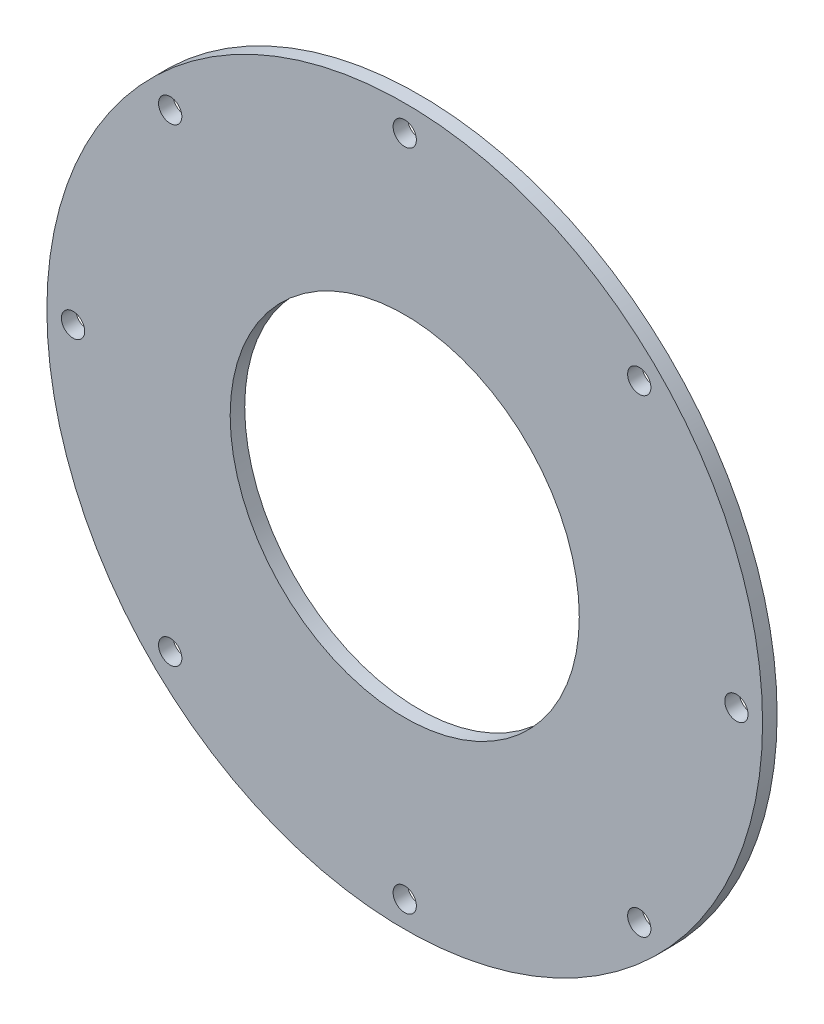
ISO-10303-21;
HEADER;
FILE_DESCRIPTION(('STEP AP214'),'2;1');
FILE_NAME('part.step','',(''),(''),'','','');
FILE_SCHEMA(('AUTOMOTIVE_DESIGN { 1 0 10303 214 1 1 1 1 }'));
ENDSEC;
DATA;
#1=APPLICATION_CONTEXT('core data for automotive mechanical design processes');
#2=APPLICATION_PROTOCOL_DEFINITION('international standard','automotive_design',2000,#1);
#3=PRODUCT_CONTEXT('',#1,'mechanical');
#4=PRODUCT('Part','Part','',(#3));
#5=PRODUCT_RELATED_PRODUCT_CATEGORY('part','',(#4));
#6=PRODUCT_DEFINITION_FORMATION('','',#4);
#7=PRODUCT_DEFINITION_CONTEXT('part definition',#1,'design');
#8=PRODUCT_DEFINITION('design','',#6,#7);
#9=PRODUCT_DEFINITION_SHAPE('','',#8);
#10=(LENGTH_UNIT() NAMED_UNIT(*) SI_UNIT(.MILLI.,.METRE.));
#11=(NAMED_UNIT(*) PLANE_ANGLE_UNIT() SI_UNIT($,.RADIAN.));
#12=(NAMED_UNIT(*) SI_UNIT($,.STERADIAN.) SOLID_ANGLE_UNIT());
#13=UNCERTAINTY_MEASURE_WITH_UNIT(LENGTH_MEASURE(1.E-05),#10,'distance_accuracy_value','');
#14=(GEOMETRIC_REPRESENTATION_CONTEXT(3) GLOBAL_UNCERTAINTY_ASSIGNED_CONTEXT((#13)) GLOBAL_UNIT_ASSIGNED_CONTEXT((#10,
#11,#12)) REPRESENTATION_CONTEXT('',''));
#15=CARTESIAN_POINT('',(0.,0.,0.));
#16=DIRECTION('',(0.,0.,1.));
#17=DIRECTION('',(1.,0.,0.));
#18=AXIS2_PLACEMENT_3D('',#15,#16,#17);
#19=CARTESIAN_POINT('',(0.,0.,2.5));
#20=DIRECTION('',(0.,0.,1.));
#21=DIRECTION('',(1.,0.,0.));
#22=AXIS2_PLACEMENT_3D('',#19,#20,#21);
#23=PLANE('',#22);
#24=CARTESIAN_POINT('',(0.,0.,2.5));
#25=DIRECTION('',(0.,0.,1.));
#26=DIRECTION('',(1.,0.,0.));
#27=AXIS2_PLACEMENT_3D('',#24,#25,#26);
#28=CIRCLE('',#27,30.);
#29=CARTESIAN_POINT('',(30.,0.,2.5));
#30=VERTEX_POINT('',#29);
#31=EDGE_CURVE('E117',#30,#30,#28,.T.);
#32=ORIENTED_EDGE('',*,*,#31,.F.);
#33=EDGE_LOOP('',(#32));
#34=FACE_BOUND('',#33,.T.);
#35=CARTESIAN_POINT('',(57.,-5.96492217882559E-13,2.5));
#36=DIRECTION('',(0.,0.,1.));
#37=DIRECTION('',(1.,0.,0.));
#38=AXIS2_PLACEMENT_3D('',#35,#36,#37);
#39=CIRCLE('',#38,2.);
#40=CARTESIAN_POINT('',(59.,-5.96492217882559E-13,2.5));
#41=VERTEX_POINT('',#40);
#42=EDGE_CURVE('E98',#41,#41,#39,.T.);
#43=ORIENTED_EDGE('',*,*,#42,.F.);
#44=EDGE_LOOP('',(#43));
#45=FACE_BOUND('',#44,.T.);
#46=CARTESIAN_POINT('',(3.97477781568501E-13,57.,2.5));
#47=DIRECTION('',(0.,0.,1.));
#48=DIRECTION('',(1.,0.,0.));
#49=AXIS2_PLACEMENT_3D('',#46,#47,#48);
#50=CIRCLE('',#49,2.);
#51=CARTESIAN_POINT('',(2.0000000000004,57.,2.5));
#52=VERTEX_POINT('',#51);
#53=EDGE_CURVE('E82',#52,#52,#50,.T.);
#54=ORIENTED_EDGE('',*,*,#53,.F.);
#55=EDGE_LOOP('',(#54));
#56=FACE_BOUND('',#55,.T.);
#57=CARTESIAN_POINT('',(-57.,1.00835959934104E-12,2.5));
#58=DIRECTION('',(0.,0.,1.));
#59=DIRECTION('',(1.,0.,0.));
#60=AXIS2_PLACEMENT_3D('',#57,#58,#59);
#61=CIRCLE('',#60,2.);
#62=CARTESIAN_POINT('',(-55.,1.00835959934104E-12,2.5));
#63=VERTEX_POINT('',#62);
#64=EDGE_CURVE('E66',#63,#63,#61,.T.);
#65=ORIENTED_EDGE('',*,*,#64,.F.);
#66=EDGE_LOOP('',(#65));
#67=FACE_BOUND('',#66,.T.);
#68=CARTESIAN_POINT('',(0.,-57.,2.5));
#69=DIRECTION('',(0.,0.,1.));
#70=DIRECTION('',(1.,0.,0.));
#71=AXIS2_PLACEMENT_3D('',#68,#69,#70);
#72=CIRCLE('',#71,2.);
#73=CARTESIAN_POINT('',(2.,-57.,2.5));
#74=VERTEX_POINT('',#73);
#75=EDGE_CURVE('E52',#74,#74,#72,.T.);
#76=ORIENTED_EDGE('',*,*,#75,.F.);
#77=EDGE_LOOP('',(#76));
#78=FACE_BOUND('',#77,.T.);
#79=CARTESIAN_POINT('',(0.,0.,2.5));
#80=DIRECTION('',(0.,0.,1.));
#81=DIRECTION('',(1.,0.,0.));
#82=AXIS2_PLACEMENT_3D('',#79,#80,#81);
#83=CIRCLE('',#82,61.5);
#84=CARTESIAN_POINT('',(61.5,0.,2.5));
#85=VERTEX_POINT('',#84);
#86=EDGE_CURVE('E10',#85,#85,#83,.T.);
#87=ORIENTED_EDGE('',*,*,#86,.T.);
#88=EDGE_LOOP('',(#87));
#89=FACE_BOUND('',#88,.T.);
#90=CARTESIAN_POINT('',(-40.3050865276338,-40.3050865276326,2.5));
#91=DIRECTION('',(0.,0.,1.));
#92=DIRECTION('',(1.,0.,0.));
#93=AXIS2_PLACEMENT_3D('',#90,#91,#92);
#94=CIRCLE('',#93,2.00000000000001);
#95=CARTESIAN_POINT('',(-38.3050865276338,-40.3050865276326,2.5));
#96=VERTEX_POINT('',#95);
#97=EDGE_CURVE('E58',#96,#96,#94,.T.);
#98=ORIENTED_EDGE('',*,*,#97,.F.);
#99=EDGE_LOOP('',(#98));
#100=FACE_BOUND('',#99,.T.);
#101=CARTESIAN_POINT('',(-40.305086527633,40.3050865276334,2.5));
#102=DIRECTION('',(0.,0.,1.));
#103=DIRECTION('',(1.,0.,0.));
#104=AXIS2_PLACEMENT_3D('',#101,#102,#103);
#105=CIRCLE('',#104,2.00000000000001);
#106=CARTESIAN_POINT('',(-38.305086527633,40.3050865276334,2.5));
#107=VERTEX_POINT('',#106);
#108=EDGE_CURVE('E74',#107,#107,#105,.T.);
#109=ORIENTED_EDGE('',*,*,#108,.F.);
#110=EDGE_LOOP('',(#109));
#111=FACE_BOUND('',#110,.T.);
#112=CARTESIAN_POINT('',(40.3050865276336,40.3050865276329,2.5));
#113=DIRECTION('',(0.,0.,1.));
#114=DIRECTION('',(1.,0.,0.));
#115=AXIS2_PLACEMENT_3D('',#112,#113,#114);
#116=CIRCLE('',#115,2.00000000000001);
#117=CARTESIAN_POINT('',(42.3050865276336,40.3050865276329,2.5));
#118=VERTEX_POINT('',#117);
#119=EDGE_CURVE('E90',#118,#118,#116,.T.);
#120=ORIENTED_EDGE('',*,*,#119,.F.);
#121=EDGE_LOOP('',(#120));
#122=FACE_BOUND('',#121,.T.);
#123=CARTESIAN_POINT('',(40.3050865276327,-40.3050865276337,2.5));
#124=DIRECTION('',(0.,0.,1.));
#125=DIRECTION('',(1.,0.,0.));
#126=AXIS2_PLACEMENT_3D('',#123,#124,#125);
#127=CIRCLE('',#126,2.00000000000001);
#128=CARTESIAN_POINT('',(42.3050865276327,-40.3050865276337,2.5));
#129=VERTEX_POINT('',#128);
#130=EDGE_CURVE('E106',#129,#129,#127,.T.);
#131=ORIENTED_EDGE('',*,*,#130,.F.);
#132=EDGE_LOOP('',(#131));
#133=FACE_BOUND('',#132,.T.);
#134=ADVANCED_FACE('F37',(#34,#45,#56,#67,#78,#89,#100,#111,#122,#133),#23,.T.);
#135=CARTESIAN_POINT('',(0.,0.,0.));
#136=DIRECTION('',(0.,0.,1.));
#137=DIRECTION('',(1.,0.,0.));
#138=AXIS2_PLACEMENT_3D('',#135,#136,#137);
#139=PLANE('',#138);
#140=CARTESIAN_POINT('',(0.,0.,0.));
#141=DIRECTION('',(0.,0.,1.));
#142=DIRECTION('',(1.,0.,0.));
#143=AXIS2_PLACEMENT_3D('',#140,#141,#142);
#144=CIRCLE('',#143,30.);
#145=CARTESIAN_POINT('',(30.,0.,0.));
#146=VERTEX_POINT('',#145);
#147=EDGE_CURVE('E41',#146,#146,#144,.T.);
#148=ORIENTED_EDGE('',*,*,#147,.T.);
#149=EDGE_LOOP('',(#148));
#150=FACE_BOUND('',#149,.T.);
#151=CARTESIAN_POINT('',(0.,0.,0.));
#152=DIRECTION('',(0.,0.,1.));
#153=DIRECTION('',(1.,0.,0.));
#154=AXIS2_PLACEMENT_3D('',#151,#152,#153);
#155=CIRCLE('',#154,61.5);
#156=CARTESIAN_POINT('',(61.5,0.,0.));
#157=VERTEX_POINT('',#156);
#158=EDGE_CURVE('E46',#157,#157,#155,.T.);
#159=ORIENTED_EDGE('',*,*,#158,.F.);
#160=EDGE_LOOP('',(#159));
#161=FACE_BOUND('',#160,.T.);
#162=CARTESIAN_POINT('',(0.,-57.,0.));
#163=DIRECTION('',(0.,0.,1.));
#164=DIRECTION('',(1.,0.,0.));
#165=AXIS2_PLACEMENT_3D('',#162,#163,#164);
#166=CIRCLE('',#165,2.);
#167=CARTESIAN_POINT('',(2.,-57.,0.));
#168=VERTEX_POINT('',#167);
#169=EDGE_CURVE('E54',#168,#168,#166,.T.);
#170=ORIENTED_EDGE('',*,*,#169,.T.);
#171=EDGE_LOOP('',(#170));
#172=FACE_BOUND('',#171,.T.);
#173=CARTESIAN_POINT('',(-40.3050865276338,-40.3050865276326,0.));
#174=DIRECTION('',(0.,0.,1.));
#175=DIRECTION('',(1.,0.,0.));
#176=AXIS2_PLACEMENT_3D('',#173,#174,#175);
#177=CIRCLE('',#176,2.00000000000001);
#178=CARTESIAN_POINT('',(-38.3050865276338,-40.3050865276326,0.));
#179=VERTEX_POINT('',#178);
#180=EDGE_CURVE('E62',#179,#179,#177,.T.);
#181=ORIENTED_EDGE('',*,*,#180,.T.);
#182=EDGE_LOOP('',(#181));
#183=FACE_BOUND('',#182,.T.);
#184=CARTESIAN_POINT('',(-57.,1.00835959934104E-12,0.));
#185=DIRECTION('',(0.,0.,1.));
#186=DIRECTION('',(1.,0.,0.));
#187=AXIS2_PLACEMENT_3D('',#184,#185,#186);
#188=CIRCLE('',#187,2.);
#189=CARTESIAN_POINT('',(-55.,1.00835959934104E-12,0.));
#190=VERTEX_POINT('',#189);
#191=EDGE_CURVE('E70',#190,#190,#188,.T.);
#192=ORIENTED_EDGE('',*,*,#191,.T.);
#193=EDGE_LOOP('',(#192));
#194=FACE_BOUND('',#193,.T.);
#195=CARTESIAN_POINT('',(-40.305086527633,40.3050865276334,0.));
#196=DIRECTION('',(0.,0.,1.));
#197=DIRECTION('',(1.,0.,0.));
#198=AXIS2_PLACEMENT_3D('',#195,#196,#197);
#199=CIRCLE('',#198,2.00000000000001);
#200=CARTESIAN_POINT('',(-38.305086527633,40.3050865276334,0.));
#201=VERTEX_POINT('',#200);
#202=EDGE_CURVE('E78',#201,#201,#199,.T.);
#203=ORIENTED_EDGE('',*,*,#202,.T.);
#204=EDGE_LOOP('',(#203));
#205=FACE_BOUND('',#204,.T.);
#206=CARTESIAN_POINT('',(3.97477781568501E-13,57.,0.));
#207=DIRECTION('',(0.,0.,1.));
#208=DIRECTION('',(1.,0.,0.));
#209=AXIS2_PLACEMENT_3D('',#206,#207,#208);
#210=CIRCLE('',#209,2.);
#211=CARTESIAN_POINT('',(2.0000000000004,57.,0.));
#212=VERTEX_POINT('',#211);
#213=EDGE_CURVE('E86',#212,#212,#210,.T.);
#214=ORIENTED_EDGE('',*,*,#213,.T.);
#215=EDGE_LOOP('',(#214));
#216=FACE_BOUND('',#215,.T.);
#217=CARTESIAN_POINT('',(40.3050865276336,40.3050865276329,0.));
#218=DIRECTION('',(0.,0.,1.));
#219=DIRECTION('',(1.,0.,0.));
#220=AXIS2_PLACEMENT_3D('',#217,#218,#219);
#221=CIRCLE('',#220,2.00000000000001);
#222=CARTESIAN_POINT('',(42.3050865276336,40.3050865276329,0.));
#223=VERTEX_POINT('',#222);
#224=EDGE_CURVE('E94',#223,#223,#221,.T.);
#225=ORIENTED_EDGE('',*,*,#224,.T.);
#226=EDGE_LOOP('',(#225));
#227=FACE_BOUND('',#226,.T.);
#228=CARTESIAN_POINT('',(57.,-5.96492217882559E-13,0.));
#229=DIRECTION('',(0.,0.,1.));
#230=DIRECTION('',(1.,0.,0.));
#231=AXIS2_PLACEMENT_3D('',#228,#229,#230);
#232=CIRCLE('',#231,2.);
#233=CARTESIAN_POINT('',(59.,-5.96492217882559E-13,0.));
#234=VERTEX_POINT('',#233);
#235=EDGE_CURVE('E102',#234,#234,#232,.T.);
#236=ORIENTED_EDGE('',*,*,#235,.T.);
#237=EDGE_LOOP('',(#236));
#238=FACE_BOUND('',#237,.T.);
#239=CARTESIAN_POINT('',(40.3050865276327,-40.3050865276337,0.));
#240=DIRECTION('',(0.,0.,1.));
#241=DIRECTION('',(1.,0.,0.));
#242=AXIS2_PLACEMENT_3D('',#239,#240,#241);
#243=CIRCLE('',#242,2.00000000000001);
#244=CARTESIAN_POINT('',(42.3050865276327,-40.3050865276337,0.));
#245=VERTEX_POINT('',#244);
#246=EDGE_CURVE('E110',#245,#245,#243,.T.);
#247=ORIENTED_EDGE('',*,*,#246,.T.);
#248=EDGE_LOOP('',(#247));
#249=FACE_BOUND('',#248,.T.);
#250=ADVANCED_FACE('F126',(#150,#161,#172,#183,#194,#205,#216,#227,#238,#249),#139,.F.);
#251=CARTESIAN_POINT('',(0.,0.,2.5));
#252=DIRECTION('',(0.,0.,-1.));
#253=DIRECTION('',(-1.,0.,0.));
#254=AXIS2_PLACEMENT_3D('',#251,#252,#253);
#255=CYLINDRICAL_SURFACE('',#254,61.5);
#256=ORIENTED_EDGE('',*,*,#86,.F.);
#257=EDGE_LOOP('',(#256));
#258=FACE_BOUND('',#257,.T.);
#259=ORIENTED_EDGE('',*,*,#158,.T.);
#260=EDGE_LOOP('',(#259));
#261=FACE_BOUND('',#260,.T.);
#262=ADVANCED_FACE('F39',(#258,#261),#255,.T.);
#263=CARTESIAN_POINT('',(0.,-57.,2.5));
#264=DIRECTION('',(0.,0.,-1.));
#265=DIRECTION('',(-1.,0.,0.));
#266=AXIS2_PLACEMENT_3D('',#263,#264,#265);
#267=CYLINDRICAL_SURFACE('',#266,2.);
#268=ORIENTED_EDGE('',*,*,#75,.T.);
#269=EDGE_LOOP('',(#268));
#270=FACE_BOUND('',#269,.T.);
#271=ORIENTED_EDGE('',*,*,#169,.F.);
#272=EDGE_LOOP('',(#271));
#273=FACE_BOUND('',#272,.T.);
#274=ADVANCED_FACE('F147',(#270,#273),#267,.F.);
#275=CARTESIAN_POINT('',(-40.3050865276338,-40.3050865276326,2.5));
#276=DIRECTION('',(0.,0.,-1.));
#277=DIRECTION('',(-1.,0.,0.));
#278=AXIS2_PLACEMENT_3D('',#275,#276,#277);
#279=CYLINDRICAL_SURFACE('',#278,2.00000000000001);
#280=ORIENTED_EDGE('',*,*,#97,.T.);
#281=EDGE_LOOP('',(#280));
#282=FACE_BOUND('',#281,.T.);
#283=ORIENTED_EDGE('',*,*,#180,.F.);
#284=EDGE_LOOP('',(#283));
#285=FACE_BOUND('',#284,.T.);
#286=ADVANCED_FACE('F150',(#282,#285),#279,.F.);
#287=CARTESIAN_POINT('',(-57.,1.00835959934104E-12,2.5));
#288=DIRECTION('',(0.,0.,-1.));
#289=DIRECTION('',(-1.,0.,0.));
#290=AXIS2_PLACEMENT_3D('',#287,#288,#289);
#291=CYLINDRICAL_SURFACE('',#290,2.);
#292=ORIENTED_EDGE('',*,*,#64,.T.);
#293=EDGE_LOOP('',(#292));
#294=FACE_BOUND('',#293,.T.);
#295=ORIENTED_EDGE('',*,*,#191,.F.);
#296=EDGE_LOOP('',(#295));
#297=FACE_BOUND('',#296,.T.);
#298=ADVANCED_FACE('F154',(#294,#297),#291,.F.);
#299=CARTESIAN_POINT('',(-40.305086527633,40.3050865276334,2.5));
#300=DIRECTION('',(0.,0.,-1.));
#301=DIRECTION('',(-1.,0.,0.));
#302=AXIS2_PLACEMENT_3D('',#299,#300,#301);
#303=CYLINDRICAL_SURFACE('',#302,2.00000000000001);
#304=ORIENTED_EDGE('',*,*,#108,.T.);
#305=EDGE_LOOP('',(#304));
#306=FACE_BOUND('',#305,.T.);
#307=ORIENTED_EDGE('',*,*,#202,.F.);
#308=EDGE_LOOP('',(#307));
#309=FACE_BOUND('',#308,.T.);
#310=ADVANCED_FACE('F158',(#306,#309),#303,.F.);
#311=CARTESIAN_POINT('',(3.97477781568501E-13,57.,2.5));
#312=DIRECTION('',(0.,0.,-1.));
#313=DIRECTION('',(-1.,0.,0.));
#314=AXIS2_PLACEMENT_3D('',#311,#312,#313);
#315=CYLINDRICAL_SURFACE('',#314,2.);
#316=ORIENTED_EDGE('',*,*,#53,.T.);
#317=EDGE_LOOP('',(#316));
#318=FACE_BOUND('',#317,.T.);
#319=ORIENTED_EDGE('',*,*,#213,.F.);
#320=EDGE_LOOP('',(#319));
#321=FACE_BOUND('',#320,.T.);
#322=ADVANCED_FACE('F162',(#318,#321),#315,.F.);
#323=CARTESIAN_POINT('',(40.3050865276336,40.3050865276329,2.5));
#324=DIRECTION('',(0.,0.,-1.));
#325=DIRECTION('',(-1.,0.,0.));
#326=AXIS2_PLACEMENT_3D('',#323,#324,#325);
#327=CYLINDRICAL_SURFACE('',#326,2.00000000000001);
#328=ORIENTED_EDGE('',*,*,#119,.T.);
#329=EDGE_LOOP('',(#328));
#330=FACE_BOUND('',#329,.T.);
#331=ORIENTED_EDGE('',*,*,#224,.F.);
#332=EDGE_LOOP('',(#331));
#333=FACE_BOUND('',#332,.T.);
#334=ADVANCED_FACE('F166',(#330,#333),#327,.F.);
#335=CARTESIAN_POINT('',(57.,-5.96492217882559E-13,2.5));
#336=DIRECTION('',(0.,0.,-1.));
#337=DIRECTION('',(-1.,0.,0.));
#338=AXIS2_PLACEMENT_3D('',#335,#336,#337);
#339=CYLINDRICAL_SURFACE('',#338,2.);
#340=ORIENTED_EDGE('',*,*,#42,.T.);
#341=EDGE_LOOP('',(#340));
#342=FACE_BOUND('',#341,.T.);
#343=ORIENTED_EDGE('',*,*,#235,.F.);
#344=EDGE_LOOP('',(#343));
#345=FACE_BOUND('',#344,.T.);
#346=ADVANCED_FACE('F136',(#342,#345),#339,.F.);
#347=CARTESIAN_POINT('',(40.3050865276327,-40.3050865276337,2.5));
#348=DIRECTION('',(0.,0.,-1.));
#349=DIRECTION('',(-1.,0.,0.));
#350=AXIS2_PLACEMENT_3D('',#347,#348,#349);
#351=CYLINDRICAL_SURFACE('',#350,2.00000000000001);
#352=ORIENTED_EDGE('',*,*,#130,.T.);
#353=EDGE_LOOP('',(#352));
#354=FACE_BOUND('',#353,.T.);
#355=ORIENTED_EDGE('',*,*,#246,.F.);
#356=EDGE_LOOP('',(#355));
#357=FACE_BOUND('',#356,.T.);
#358=ADVANCED_FACE('F131',(#354,#357),#351,.F.);
#359=CARTESIAN_POINT('',(0.,0.,-7.5));
#360=DIRECTION('',(0.,0.,1.));
#361=DIRECTION('',(1.,0.,0.));
#362=AXIS2_PLACEMENT_3D('',#359,#360,#361);
#363=CYLINDRICAL_SURFACE('',#362,30.);
#364=ORIENTED_EDGE('',*,*,#31,.T.);
#365=EDGE_LOOP('',(#364));
#366=FACE_BOUND('',#365,.T.);
#367=ORIENTED_EDGE('',*,*,#147,.F.);
#368=EDGE_LOOP('',(#367));
#369=FACE_BOUND('',#368,.T.);
#370=ADVANCED_FACE('F129',(#366,#369),#363,.F.);
#371=CLOSED_SHELL('',(#134,#250,#262,#274,#286,#298,#310,#322,#334,#346,#358,#370));
#372=MANIFOLD_SOLID_BREP('B2',#371);
#373=ADVANCED_BREP_SHAPE_REPRESENTATION('',(#18,#372),#14);
#374=SHAPE_DEFINITION_REPRESENTATION(#9,#373);
ENDSEC;
END-ISO-10303-21;
